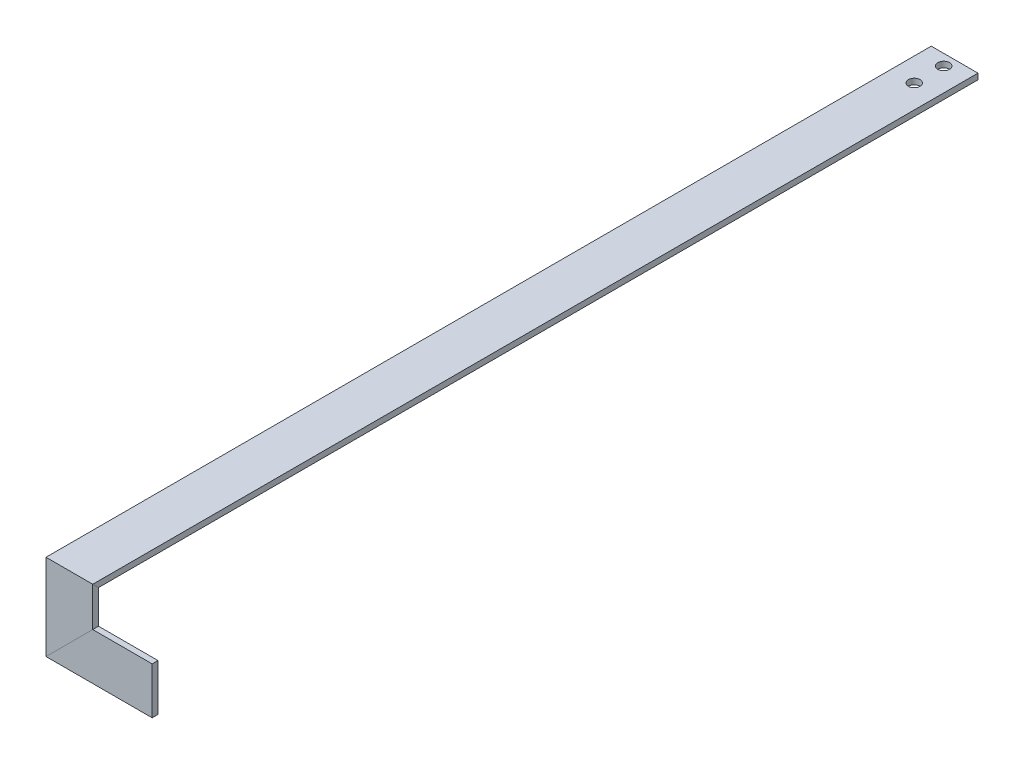
ISO-10303-21;
HEADER;
FILE_DESCRIPTION(('STEP AP214'),'2;1');
FILE_NAME('part.step','',(''),(''),'','','');
FILE_SCHEMA(('AUTOMOTIVE_DESIGN { 1 0 10303 214 1 1 1 1 }'));
ENDSEC;
DATA;
#1=APPLICATION_CONTEXT('core data for automotive mechanical design processes');
#2=APPLICATION_PROTOCOL_DEFINITION('international standard','automotive_design',2000,#1);
#3=PRODUCT_CONTEXT('',#1,'mechanical');
#4=PRODUCT('Part','Part','',(#3));
#5=PRODUCT_RELATED_PRODUCT_CATEGORY('part','',(#4));
#6=PRODUCT_DEFINITION_FORMATION('','',#4);
#7=PRODUCT_DEFINITION_CONTEXT('part definition',#1,'design');
#8=PRODUCT_DEFINITION('design','',#6,#7);
#9=PRODUCT_DEFINITION_SHAPE('','',#8);
#10=(LENGTH_UNIT() NAMED_UNIT(*) SI_UNIT(.MILLI.,.METRE.));
#11=(NAMED_UNIT(*) PLANE_ANGLE_UNIT() SI_UNIT($,.RADIAN.));
#12=(NAMED_UNIT(*) SI_UNIT($,.STERADIAN.) SOLID_ANGLE_UNIT());
#13=UNCERTAINTY_MEASURE_WITH_UNIT(LENGTH_MEASURE(1.E-05),#10,'distance_accuracy_value','');
#14=(GEOMETRIC_REPRESENTATION_CONTEXT(3) GLOBAL_UNCERTAINTY_ASSIGNED_CONTEXT((#13)) GLOBAL_UNIT_ASSIGNED_CONTEXT((#10,
#11,#12)) REPRESENTATION_CONTEXT('',''));
#15=CARTESIAN_POINT('',(0.,0.,0.));
#16=DIRECTION('',(0.,0.,1.));
#17=DIRECTION('',(1.,0.,0.));
#18=AXIS2_PLACEMENT_3D('',#15,#16,#17);
#19=CARTESIAN_POINT('',(89.9999999999997,-64.9,958.84));
#20=DIRECTION('',(1.,0.,0.));
#21=DIRECTION('',(0.,1.,0.));
#22=AXIS2_PLACEMENT_3D('',#19,#20,#21);
#23=PLANE('',#22);
#24=DIRECTION('',(0.,0.,1.));
#25=VECTOR('',#24,1.);
#26=CARTESIAN_POINT('',(89.9999999999997,-39.5,961.995));
#27=LINE('',#26,#25);
#28=CARTESIAN_POINT('',(89.9999999999997,-39.5,955.685));
#29=VERTEX_POINT('',#28);
#30=CARTESIAN_POINT('',(89.9999999999997,-39.5,961.995));
#31=VERTEX_POINT('',#30);
#32=EDGE_CURVE('E84',#29,#31,#27,.T.);
#33=ORIENTED_EDGE('',*,*,#32,.T.);
#34=DIRECTION('',(0.,-1.,0.));
#35=VECTOR('',#34,1.);
#36=CARTESIAN_POINT('',(89.9999999999997,-90.3,961.995));
#37=LINE('',#36,#35);
#38=CARTESIAN_POINT('',(89.9999999999997,-90.3,961.995));
#39=VERTEX_POINT('',#38);
#40=EDGE_CURVE('E82',#31,#39,#37,.T.);
#41=ORIENTED_EDGE('',*,*,#40,.T.);
#42=DIRECTION('',(0.,0.,-1.));
#43=VECTOR('',#42,1.);
#44=CARTESIAN_POINT('',(89.9999999999997,-90.3,961.995));
#45=LINE('',#44,#43);
#46=CARTESIAN_POINT('',(89.9999999999997,-90.3,955.685));
#47=VERTEX_POINT('',#46);
#48=EDGE_CURVE('E79',#39,#47,#45,.T.);
#49=ORIENTED_EDGE('',*,*,#48,.T.);
#50=DIRECTION('',(0.,1.,0.));
#51=VECTOR('',#50,1.);
#52=CARTESIAN_POINT('',(89.9999999999997,-90.3,955.685));
#53=LINE('',#52,#51);
#54=EDGE_CURVE('E99',#47,#29,#53,.T.);
#55=ORIENTED_EDGE('',*,*,#54,.T.);
#56=EDGE_LOOP('',(#33,#41,#49,#55));
#57=FACE_BOUND('',#56,.T.);
#58=ADVANCED_FACE('F33',(#57),#23,.T.);
#59=CARTESIAN_POINT('',(0.,0.,0.));
#60=DIRECTION('',(0.,0.,1.));
#61=DIRECTION('',(1.,0.,0.));
#62=AXIS2_PLACEMENT_3D('',#59,#60,#61);
#63=PLANE('',#62);
#64=DIRECTION('',(0.,1.,0.));
#65=VECTOR('',#64,1.);
#66=CARTESIAN_POINT('',(25.4,3.155,0.));
#67=LINE('',#66,#65);
#68=CARTESIAN_POINT('',(25.4,-3.155,0.));
#69=VERTEX_POINT('',#68);
#70=CARTESIAN_POINT('',(25.4,3.155,0.));
#71=VERTEX_POINT('',#70);
#72=EDGE_CURVE('E141',#69,#71,#67,.T.);
#73=ORIENTED_EDGE('',*,*,#72,.F.);
#74=DIRECTION('',(1.,0.,0.));
#75=VECTOR('',#74,1.);
#76=CARTESIAN_POINT('',(-25.4,-3.155,0.));
#77=LINE('',#76,#75);
#78=CARTESIAN_POINT('',(-25.4,-3.155,0.));
#79=VERTEX_POINT('',#78);
#80=EDGE_CURVE('E147',#79,#69,#77,.T.);
#81=ORIENTED_EDGE('',*,*,#80,.F.);
#82=DIRECTION('',(0.,-1.,0.));
#83=VECTOR('',#82,1.);
#84=CARTESIAN_POINT('',(-25.4,3.155,0.));
#85=LINE('',#84,#83);
#86=CARTESIAN_POINT('',(-25.4,3.155,0.));
#87=VERTEX_POINT('',#86);
#88=EDGE_CURVE('E131',#87,#79,#85,.T.);
#89=ORIENTED_EDGE('',*,*,#88,.F.);
#90=DIRECTION('',(-1.,0.,0.));
#91=VECTOR('',#90,1.);
#92=CARTESIAN_POINT('',(-25.4,3.155,0.));
#93=LINE('',#92,#91);
#94=EDGE_CURVE('E137',#71,#87,#93,.T.);
#95=ORIENTED_EDGE('',*,*,#94,.F.);
#96=EDGE_LOOP('',(#73,#81,#89,#95));
#97=FACE_BOUND('',#96,.T.);
#98=ADVANCED_FACE('F334',(#97),#63,.F.);
#99=CARTESIAN_POINT('',(-28.04,-90.3,961.995));
#100=DIRECTION('',(0.,-1.,0.));
#101=DIRECTION('',(0.,0.,-1.));
#102=AXIS2_PLACEMENT_3D('',#99,#100,#101);
#103=PLANE('',#102);
#104=DIRECTION('',(0.,0.,1.));
#105=VECTOR('',#104,1.);
#106=CARTESIAN_POINT('',(-25.4,-90.3,961.995));
#107=LINE('',#106,#105);
#108=CARTESIAN_POINT('',(-25.4,-90.3,955.685));
#109=VERTEX_POINT('',#108);
#110=CARTESIAN_POINT('',(-25.4,-90.3,961.995));
#111=VERTEX_POINT('',#110);
#112=EDGE_CURVE('E115',#109,#111,#107,.T.);
#113=ORIENTED_EDGE('',*,*,#112,.F.);
#114=DIRECTION('',(1.,0.,0.));
#115=VECTOR('',#114,1.);
#116=CARTESIAN_POINT('',(-28.04,-90.3,955.685));
#117=LINE('',#116,#115);
#118=EDGE_CURVE('E97',#109,#47,#117,.T.);
#119=ORIENTED_EDGE('',*,*,#118,.T.);
#120=ORIENTED_EDGE('',*,*,#48,.F.);
#121=DIRECTION('',(1.,0.,0.));
#122=VECTOR('',#121,1.);
#123=CARTESIAN_POINT('',(-28.04,-90.3,961.995));
#124=LINE('',#123,#122);
#125=EDGE_CURVE('E36',#111,#39,#124,.T.);
#126=ORIENTED_EDGE('',*,*,#125,.F.);
#127=EDGE_LOOP('',(#113,#119,#120,#126));
#128=FACE_BOUND('',#127,.T.);
#129=ADVANCED_FACE('F94',(#128),#103,.T.);
#130=CARTESIAN_POINT('',(-28.04,-90.3,955.685));
#131=DIRECTION('',(0.,0.,-1.));
#132=DIRECTION('',(-1.,0.,0.));
#133=AXIS2_PLACEMENT_3D('',#130,#131,#132);
#134=PLANE('',#133);
#135=DIRECTION('',(-0.707106781186548,-0.707106781186548,0.));
#136=VECTOR('',#135,1.);
#137=CARTESIAN_POINT('',(21.53525,-43.36475,955.685));
#138=LINE('',#137,#136);
#139=CARTESIAN_POINT('',(25.4,-39.5,955.685));
#140=VERTEX_POINT('',#139);
#141=EDGE_CURVE('E128',#140,#109,#138,.T.);
#142=ORIENTED_EDGE('',*,*,#141,.F.);
#143=DIRECTION('',(1.,0.,0.));
#144=VECTOR('',#143,1.);
#145=CARTESIAN_POINT('',(-28.04,-39.5,955.685));
#146=LINE('',#145,#144);
#147=EDGE_CURVE('E108',#140,#29,#146,.T.);
#148=ORIENTED_EDGE('',*,*,#147,.T.);
#149=ORIENTED_EDGE('',*,*,#54,.F.);
#150=ORIENTED_EDGE('',*,*,#118,.F.);
#151=EDGE_LOOP('',(#142,#148,#149,#150));
#152=FACE_BOUND('',#151,.T.);
#153=ADVANCED_FACE('F317',(#152),#134,.T.);
#154=CARTESIAN_POINT('',(-28.04,-39.5,961.995));
#155=DIRECTION('',(0.,1.,0.));
#156=DIRECTION('',(0.,0.,1.));
#157=AXIS2_PLACEMENT_3D('',#154,#155,#156);
#158=PLANE('',#157);
#159=DIRECTION('',(0.,0.,-1.));
#160=VECTOR('',#159,1.);
#161=CARTESIAN_POINT('',(25.4,-39.5,961.995));
#162=LINE('',#161,#160);
#163=CARTESIAN_POINT('',(25.4,-39.5,961.995));
#164=VERTEX_POINT('',#163);
#165=EDGE_CURVE('E125',#164,#140,#162,.T.);
#166=ORIENTED_EDGE('',*,*,#165,.F.);
#167=DIRECTION('',(1.,0.,0.));
#168=VECTOR('',#167,1.);
#169=CARTESIAN_POINT('',(-28.04,-39.5,961.995));
#170=LINE('',#169,#168);
#171=EDGE_CURVE('E98',#164,#31,#170,.T.);
#172=ORIENTED_EDGE('',*,*,#171,.T.);
#173=ORIENTED_EDGE('',*,*,#32,.F.);
#174=ORIENTED_EDGE('',*,*,#147,.F.);
#175=EDGE_LOOP('',(#166,#172,#173,#174));
#176=FACE_BOUND('',#175,.T.);
#177=ADVANCED_FACE('F232',(#176),#158,.T.);
#178=CARTESIAN_POINT('',(-28.04,-90.3,961.995));
#179=DIRECTION('',(0.,0.,1.));
#180=DIRECTION('',(1.,0.,0.));
#181=AXIS2_PLACEMENT_3D('',#178,#179,#180);
#182=PLANE('',#181);
#183=DIRECTION('',(0.707106781186548,0.707106781186548,0.));
#184=VECTOR('',#183,1.);
#185=CARTESIAN_POINT('',(21.53525,-43.36475,961.995));
#186=LINE('',#185,#184);
#187=EDGE_CURVE('E103',#111,#164,#186,.T.);
#188=ORIENTED_EDGE('',*,*,#187,.F.);
#189=ORIENTED_EDGE('',*,*,#125,.T.);
#190=ORIENTED_EDGE('',*,*,#40,.F.);
#191=ORIENTED_EDGE('',*,*,#171,.F.);
#192=EDGE_LOOP('',(#188,#189,#190,#191));
#193=FACE_BOUND('',#192,.T.);
#194=ADVANCED_FACE('F101',(#193),#182,.T.);
#195=CARTESIAN_POINT('',(-25.4,3.5705,961.995));
#196=DIRECTION('',(0.,0.,1.));
#197=DIRECTION('',(1.,0.,0.));
#198=AXIS2_PLACEMENT_3D('',#195,#196,#197);
#199=PLANE('',#198);
#200=DIRECTION('',(0.,-1.,0.));
#201=VECTOR('',#200,1.);
#202=CARTESIAN_POINT('',(-25.4,3.5705,961.995));
#203=LINE('',#202,#201);
#204=CARTESIAN_POINT('',(-25.4,3.15500000000006,961.995));
#205=VERTEX_POINT('',#204);
#206=EDGE_CURVE('E117',#205,#111,#203,.T.);
#207=ORIENTED_EDGE('',*,*,#206,.T.);
#208=ORIENTED_EDGE('',*,*,#187,.T.);
#209=DIRECTION('',(0.,-1.,0.));
#210=VECTOR('',#209,1.);
#211=CARTESIAN_POINT('',(25.4,3.5705,961.995));
#212=LINE('',#211,#210);
#213=CARTESIAN_POINT('',(25.4,3.15500000000006,961.995));
#214=VERTEX_POINT('',#213);
#215=EDGE_CURVE('E104',#214,#164,#212,.T.);
#216=ORIENTED_EDGE('',*,*,#215,.F.);
#217=DIRECTION('',(1.,0.,0.));
#218=VECTOR('',#217,1.);
#219=CARTESIAN_POINT('',(-25.4,3.155,961.995));
#220=LINE('',#219,#218);
#221=EDGE_CURVE('E135',#205,#214,#220,.T.);
#222=ORIENTED_EDGE('',*,*,#221,.F.);
#223=EDGE_LOOP('',(#207,#208,#216,#222));
#224=FACE_BOUND('',#223,.T.);
#225=ADVANCED_FACE('F224',(#224),#199,.T.);
#226=CARTESIAN_POINT('',(25.4,3.5705,961.995));
#227=DIRECTION('',(1.,0.,0.));
#228=DIRECTION('',(0.,0.,-1.));
#229=AXIS2_PLACEMENT_3D('',#226,#227,#228);
#230=PLANE('',#229);
#231=ORIENTED_EDGE('',*,*,#215,.T.);
#232=ORIENTED_EDGE('',*,*,#165,.T.);
#233=DIRECTION('',(0.,-1.,0.));
#234=VECTOR('',#233,1.);
#235=CARTESIAN_POINT('',(25.4,3.5705,955.685));
#236=LINE('',#235,#234);
#237=CARTESIAN_POINT('',(25.4,-3.15500000000001,955.685));
#238=VERTEX_POINT('',#237);
#239=EDGE_CURVE('E106',#238,#140,#236,.T.);
#240=ORIENTED_EDGE('',*,*,#239,.F.);
#241=DIRECTION('',(0.,-0.707106781186548,-0.707106781186548));
#242=VECTOR('',#241,1.);
#243=CARTESIAN_POINT('',(25.4,-477.8425,480.9975));
#244=LINE('',#243,#242);
#245=EDGE_CURVE('E42',#214,#238,#244,.T.);
#246=ORIENTED_EDGE('',*,*,#245,.F.);
#247=EDGE_LOOP('',(#231,#232,#240,#246));
#248=FACE_BOUND('',#247,.T.);
#249=ADVANCED_FACE('F222',(#248),#230,.T.);
#250=CARTESIAN_POINT('',(-25.4,3.5705,955.685));
#251=DIRECTION('',(0.,0.,-1.));
#252=DIRECTION('',(-1.,0.,0.));
#253=AXIS2_PLACEMENT_3D('',#250,#251,#252);
#254=PLANE('',#253);
#255=ORIENTED_EDGE('',*,*,#239,.T.);
#256=ORIENTED_EDGE('',*,*,#141,.T.);
#257=DIRECTION('',(0.,-1.,0.));
#258=VECTOR('',#257,1.);
#259=CARTESIAN_POINT('',(-25.4,3.5705,955.685));
#260=LINE('',#259,#258);
#261=CARTESIAN_POINT('',(-25.4,-3.15499999999998,955.685));
#262=VERTEX_POINT('',#261);
#263=EDGE_CURVE('E120',#262,#109,#260,.T.);
#264=ORIENTED_EDGE('',*,*,#263,.F.);
#265=DIRECTION('',(-1.,0.,0.));
#266=VECTOR('',#265,1.);
#267=CARTESIAN_POINT('',(-25.4,-3.155,955.685));
#268=LINE('',#267,#266);
#269=EDGE_CURVE('E11',#238,#262,#268,.T.);
#270=ORIENTED_EDGE('',*,*,#269,.F.);
#271=EDGE_LOOP('',(#255,#256,#264,#270));
#272=FACE_BOUND('',#271,.T.);
#273=ADVANCED_FACE('F216',(#272),#254,.T.);
#274=CARTESIAN_POINT('',(-25.4,3.5705,961.995));
#275=DIRECTION('',(-1.,0.,0.));
#276=DIRECTION('',(0.,0.,1.));
#277=AXIS2_PLACEMENT_3D('',#274,#275,#276);
#278=PLANE('',#277);
#279=ORIENTED_EDGE('',*,*,#263,.T.);
#280=ORIENTED_EDGE('',*,*,#112,.T.);
#281=ORIENTED_EDGE('',*,*,#206,.F.);
#282=DIRECTION('',(0.,0.707106781186548,0.707106781186548));
#283=VECTOR('',#282,1.);
#284=CARTESIAN_POINT('',(-25.4,-477.8425,480.9975));
#285=LINE('',#284,#283);
#286=EDGE_CURVE('E132',#262,#205,#285,.T.);
#287=ORIENTED_EDGE('',*,*,#286,.F.);
#288=EDGE_LOOP('',(#279,#280,#281,#287));
#289=FACE_BOUND('',#288,.T.);
#290=ADVANCED_FACE('F189',(#289),#278,.T.);
#291=CARTESIAN_POINT('',(-25.4,3.155,0.));
#292=DIRECTION('',(0.,1.,0.));
#293=DIRECTION('',(0.,0.,1.));
#294=AXIS2_PLACEMENT_3D('',#291,#292,#293);
#295=PLANE('',#294);
#296=CARTESIAN_POINT('',(6.52256026967279E-12,3.155,11.8922046657244));
#297=DIRECTION('',(0.,1.,0.));
#298=DIRECTION('',(0.,0.,1.));
#299=AXIS2_PLACEMENT_3D('',#296,#297,#298);
#300=CIRCLE('',#299,6.35000000000004);
#301=CARTESIAN_POINT('',(6.52256026967279E-12,3.155,18.2422046657244));
#302=VERTEX_POINT('',#301);
#303=EDGE_CURVE('E169',#302,#302,#300,.T.);
#304=ORIENTED_EDGE('',*,*,#303,.F.);
#305=EDGE_LOOP('',(#304));
#306=FACE_BOUND('',#305,.T.);
#307=CARTESIAN_POINT('',(6.64746035994312E-12,3.155,43.8922046657244));
#308=DIRECTION('',(0.,1.,0.));
#309=DIRECTION('',(0.,0.,1.));
#310=AXIS2_PLACEMENT_3D('',#307,#308,#309);
#311=CIRCLE('',#310,6.35000000000007);
#312=CARTESIAN_POINT('',(6.64746035994312E-12,3.155,50.2422046657245));
#313=VERTEX_POINT('',#312);
#314=EDGE_CURVE('E163',#313,#313,#311,.T.);
#315=ORIENTED_EDGE('',*,*,#314,.F.);
#316=EDGE_LOOP('',(#315));
#317=FACE_BOUND('',#316,.T.);
#318=DIRECTION('',(0.,0.,1.));
#319=VECTOR('',#318,1.);
#320=CARTESIAN_POINT('',(-25.4,3.155,0.));
#321=LINE('',#320,#319);
#322=EDGE_CURVE('E140',#87,#205,#321,.T.);
#323=ORIENTED_EDGE('',*,*,#322,.T.);
#324=ORIENTED_EDGE('',*,*,#221,.T.);
#325=DIRECTION('',(0.,0.,1.));
#326=VECTOR('',#325,1.);
#327=CARTESIAN_POINT('',(25.4,3.155,0.));
#328=LINE('',#327,#326);
#329=EDGE_CURVE('E136',#71,#214,#328,.T.);
#330=ORIENTED_EDGE('',*,*,#329,.F.);
#331=ORIENTED_EDGE('',*,*,#94,.T.);
#332=EDGE_LOOP('',(#323,#324,#330,#331));
#333=FACE_BOUND('',#332,.T.);
#334=ADVANCED_FACE('F185',(#306,#317,#333),#295,.T.);
#335=CARTESIAN_POINT('',(25.4,3.155,0.));
#336=DIRECTION('',(1.,0.,0.));
#337=DIRECTION('',(0.,0.,-1.));
#338=AXIS2_PLACEMENT_3D('',#335,#336,#337);
#339=PLANE('',#338);
#340=ORIENTED_EDGE('',*,*,#329,.T.);
#341=ORIENTED_EDGE('',*,*,#245,.T.);
#342=DIRECTION('',(0.,0.,1.));
#343=VECTOR('',#342,1.);
#344=CARTESIAN_POINT('',(25.4,-3.155,0.));
#345=LINE('',#344,#343);
#346=EDGE_CURVE('E144',#69,#238,#345,.T.);
#347=ORIENTED_EDGE('',*,*,#346,.F.);
#348=ORIENTED_EDGE('',*,*,#72,.T.);
#349=EDGE_LOOP('',(#340,#341,#347,#348));
#350=FACE_BOUND('',#349,.T.);
#351=ADVANCED_FACE('F188',(#350),#339,.T.);
#352=CARTESIAN_POINT('',(-25.4,-3.155,0.));
#353=DIRECTION('',(0.,-1.,0.));
#354=DIRECTION('',(0.,0.,-1.));
#355=AXIS2_PLACEMENT_3D('',#352,#353,#354);
#356=PLANE('',#355);
#357=CARTESIAN_POINT('',(6.52256026967279E-12,-3.155,11.8922046657244));
#358=DIRECTION('',(0.,1.,0.));
#359=DIRECTION('',(0.,0.,1.));
#360=AXIS2_PLACEMENT_3D('',#357,#358,#359);
#361=CIRCLE('',#360,6.35000000000004);
#362=CARTESIAN_POINT('',(6.52256026967279E-12,-3.155,18.2422046657244));
#363=VERTEX_POINT('',#362);
#364=EDGE_CURVE('E166',#363,#363,#361,.T.);
#365=ORIENTED_EDGE('',*,*,#364,.T.);
#366=EDGE_LOOP('',(#365));
#367=FACE_BOUND('',#366,.T.);
#368=CARTESIAN_POINT('',(6.64746035994312E-12,-3.155,43.8922046657244));
#369=DIRECTION('',(0.,1.,0.));
#370=DIRECTION('',(0.,0.,1.));
#371=AXIS2_PLACEMENT_3D('',#368,#369,#370);
#372=CIRCLE('',#371,6.35000000000007);
#373=CARTESIAN_POINT('',(6.64746035994312E-12,-3.155,50.2422046657245));
#374=VERTEX_POINT('',#373);
#375=EDGE_CURVE('E89',#374,#374,#372,.T.);
#376=ORIENTED_EDGE('',*,*,#375,.T.);
#377=EDGE_LOOP('',(#376));
#378=FACE_BOUND('',#377,.T.);
#379=ORIENTED_EDGE('',*,*,#346,.T.);
#380=ORIENTED_EDGE('',*,*,#269,.T.);
#381=DIRECTION('',(0.,0.,1.));
#382=VECTOR('',#381,1.);
#383=CARTESIAN_POINT('',(-25.4,-3.155,0.));
#384=LINE('',#383,#382);
#385=EDGE_CURVE('E150',#79,#262,#384,.T.);
#386=ORIENTED_EDGE('',*,*,#385,.F.);
#387=ORIENTED_EDGE('',*,*,#80,.T.);
#388=EDGE_LOOP('',(#379,#380,#386,#387));
#389=FACE_BOUND('',#388,.T.);
#390=ADVANCED_FACE('F175',(#367,#378,#389),#356,.T.);
#391=CARTESIAN_POINT('',(-25.4,3.155,0.));
#392=DIRECTION('',(-1.,0.,0.));
#393=DIRECTION('',(0.,0.,1.));
#394=AXIS2_PLACEMENT_3D('',#391,#392,#393);
#395=PLANE('',#394);
#396=ORIENTED_EDGE('',*,*,#385,.T.);
#397=ORIENTED_EDGE('',*,*,#286,.T.);
#398=ORIENTED_EDGE('',*,*,#322,.F.);
#399=ORIENTED_EDGE('',*,*,#88,.T.);
#400=EDGE_LOOP('',(#396,#397,#398,#399));
#401=FACE_BOUND('',#400,.T.);
#402=ADVANCED_FACE('F199',(#401),#395,.T.);
#403=CARTESIAN_POINT('',(6.64746035994312E-12,-3.155,43.8922046657244));
#404=DIRECTION('',(0.,1.,0.));
#405=DIRECTION('',(0.,0.,1.));
#406=AXIS2_PLACEMENT_3D('',#403,#404,#405);
#407=CYLINDRICAL_SURFACE('',#406,6.35000000000007);
#408=ORIENTED_EDGE('',*,*,#375,.F.);
#409=EDGE_LOOP('',(#408));
#410=FACE_BOUND('',#409,.T.);
#411=ORIENTED_EDGE('',*,*,#314,.T.);
#412=EDGE_LOOP('',(#411));
#413=FACE_BOUND('',#412,.T.);
#414=ADVANCED_FACE('F181',(#410,#413),#407,.F.);
#415=CARTESIAN_POINT('',(6.52256026967279E-12,-3.155,11.8922046657244));
#416=DIRECTION('',(0.,1.,0.));
#417=DIRECTION('',(0.,0.,1.));
#418=AXIS2_PLACEMENT_3D('',#415,#416,#417);
#419=CYLINDRICAL_SURFACE('',#418,6.35000000000004);
#420=ORIENTED_EDGE('',*,*,#364,.F.);
#421=EDGE_LOOP('',(#420));
#422=FACE_BOUND('',#421,.T.);
#423=ORIENTED_EDGE('',*,*,#303,.T.);
#424=EDGE_LOOP('',(#423));
#425=FACE_BOUND('',#424,.T.);
#426=ADVANCED_FACE('F178',(#422,#425),#419,.F.);
#427=CLOSED_SHELL('',(#58,#98,#129,#153,#177,#194,#225,#249,#273,#290,#334,#351,#390,#402,#414,#426));
#428=MANIFOLD_SOLID_BREP('B2',#427);
#429=ADVANCED_BREP_SHAPE_REPRESENTATION('',(#18,#428),#14);
#430=SHAPE_DEFINITION_REPRESENTATION(#9,#429);
ENDSEC;
END-ISO-10303-21;
